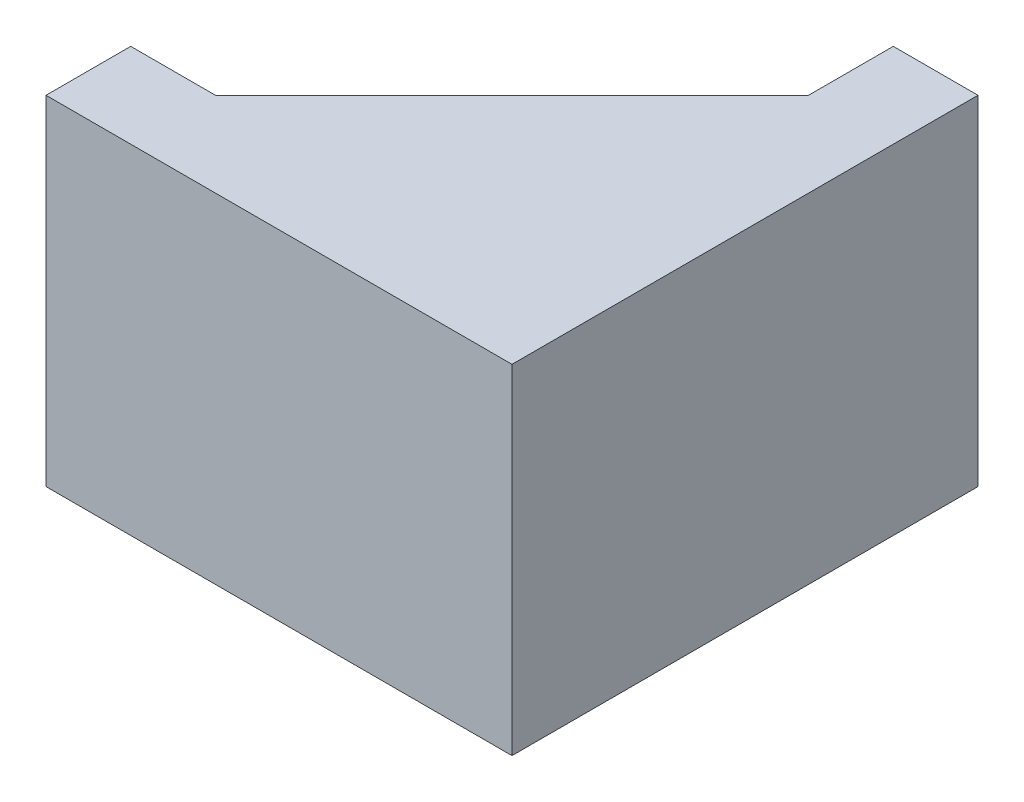
ISO-10303-21;
HEADER;
FILE_DESCRIPTION(('STEP AP214'),'2;1');
FILE_NAME('part.step','',(''),(''),'','','');
FILE_SCHEMA(('AUTOMOTIVE_DESIGN { 1 0 10303 214 1 1 1 1 }'));
ENDSEC;
DATA;
#1=APPLICATION_CONTEXT('core data for automotive mechanical design processes');
#2=APPLICATION_PROTOCOL_DEFINITION('international standard','automotive_design',2000,#1);
#3=PRODUCT_CONTEXT('',#1,'mechanical');
#4=PRODUCT('Part','Part','',(#3));
#5=PRODUCT_RELATED_PRODUCT_CATEGORY('part','',(#4));
#6=PRODUCT_DEFINITION_FORMATION('','',#4);
#7=PRODUCT_DEFINITION_CONTEXT('part definition',#1,'design');
#8=PRODUCT_DEFINITION('design','',#6,#7);
#9=PRODUCT_DEFINITION_SHAPE('','',#8);
#10=(LENGTH_UNIT() NAMED_UNIT(*) SI_UNIT(.MILLI.,.METRE.));
#11=(NAMED_UNIT(*) PLANE_ANGLE_UNIT() SI_UNIT($,.RADIAN.));
#12=(NAMED_UNIT(*) SI_UNIT($,.STERADIAN.) SOLID_ANGLE_UNIT());
#13=UNCERTAINTY_MEASURE_WITH_UNIT(LENGTH_MEASURE(1.E-05),#10,'distance_accuracy_value','');
#14=(GEOMETRIC_REPRESENTATION_CONTEXT(3) GLOBAL_UNCERTAINTY_ASSIGNED_CONTEXT((#13)) GLOBAL_UNIT_ASSIGNED_CONTEXT((#10,
#11,#12)) REPRESENTATION_CONTEXT('',''));
#15=CARTESIAN_POINT('',(0.,0.,0.));
#16=DIRECTION('',(0.,0.,1.));
#17=DIRECTION('',(1.,0.,0.));
#18=AXIS2_PLACEMENT_3D('',#15,#16,#17);
#19=CARTESIAN_POINT('',(0.,20.,0.));
#20=DIRECTION('',(-1.,0.,0.));
#21=DIRECTION('',(0.,0.,1.));
#22=AXIS2_PLACEMENT_3D('',#19,#20,#21);
#23=PLANE('',#22);
#24=DIRECTION('',(0.,0.,-1.));
#25=VECTOR('',#24,1.);
#26=CARTESIAN_POINT('',(0.,0.,0.));
#27=LINE('',#26,#25);
#28=CARTESIAN_POINT('',(0.,0.,0.));
#29=VERTEX_POINT('',#28);
#30=CARTESIAN_POINT('',(0.,0.,-27.5));
#31=VERTEX_POINT('',#30);
#32=EDGE_CURVE('E140',#29,#31,#27,.T.);
#33=ORIENTED_EDGE('',*,*,#32,.T.);
#34=DIRECTION('',(0.,-1.,0.));
#35=VECTOR('',#34,1.);
#36=CARTESIAN_POINT('',(0.,20.,-27.5));
#37=LINE('',#36,#35);
#38=CARTESIAN_POINT('',(0.,20.,-27.5));
#39=VERTEX_POINT('',#38);
#40=EDGE_CURVE('E11',#39,#31,#37,.T.);
#41=ORIENTED_EDGE('',*,*,#40,.F.);
#42=DIRECTION('',(0.,0.,-1.));
#43=VECTOR('',#42,1.);
#44=CARTESIAN_POINT('',(0.,20.,0.));
#45=LINE('',#44,#43);
#46=CARTESIAN_POINT('',(0.,20.,0.));
#47=VERTEX_POINT('',#46);
#48=EDGE_CURVE('E159',#47,#39,#45,.T.);
#49=ORIENTED_EDGE('',*,*,#48,.F.);
#50=DIRECTION('',(0.,-1.,0.));
#51=VECTOR('',#50,1.);
#52=CARTESIAN_POINT('',(0.,20.,0.));
#53=LINE('',#52,#51);
#54=EDGE_CURVE('E136',#47,#29,#53,.T.);
#55=ORIENTED_EDGE('',*,*,#54,.T.);
#56=EDGE_LOOP('',(#33,#41,#49,#55));
#57=FACE_BOUND('',#56,.T.);
#58=ADVANCED_FACE('F45',(#57),#23,.F.);
#59=CARTESIAN_POINT('',(0.,20.,-27.5));
#60=DIRECTION('',(0.,0.,1.));
#61=DIRECTION('',(1.,0.,0.));
#62=AXIS2_PLACEMENT_3D('',#59,#60,#61);
#63=PLANE('',#62);
#64=DIRECTION('',(-1.,0.,0.));
#65=VECTOR('',#64,1.);
#66=CARTESIAN_POINT('',(0.,0.,-27.5));
#67=LINE('',#66,#65);
#68=CARTESIAN_POINT('',(-5.,0.,-27.5));
#69=VERTEX_POINT('',#68);
#70=EDGE_CURVE('E144',#31,#69,#67,.T.);
#71=ORIENTED_EDGE('',*,*,#70,.T.);
#72=DIRECTION('',(0.,-1.,0.));
#73=VECTOR('',#72,1.);
#74=CARTESIAN_POINT('',(-5.,20.,-27.5));
#75=LINE('',#74,#73);
#76=CARTESIAN_POINT('',(-5.,20.,-27.5));
#77=VERTEX_POINT('',#76);
#78=EDGE_CURVE('E54',#77,#69,#75,.T.);
#79=ORIENTED_EDGE('',*,*,#78,.F.);
#80=DIRECTION('',(-1.,0.,0.));
#81=VECTOR('',#80,1.);
#82=CARTESIAN_POINT('',(0.,20.,-27.5));
#83=LINE('',#82,#81);
#84=EDGE_CURVE('E102',#39,#77,#83,.T.);
#85=ORIENTED_EDGE('',*,*,#84,.F.);
#86=ORIENTED_EDGE('',*,*,#40,.T.);
#87=EDGE_LOOP('',(#71,#79,#85,#86));
#88=FACE_BOUND('',#87,.T.);
#89=ADVANCED_FACE('F193',(#88),#63,.F.);
#90=CARTESIAN_POINT('',(-5.,20.,-27.5));
#91=DIRECTION('',(1.,0.,0.));
#92=DIRECTION('',(0.,0.,-1.));
#93=AXIS2_PLACEMENT_3D('',#90,#91,#92);
#94=PLANE('',#93);
#95=DIRECTION('',(0.,0.,1.));
#96=VECTOR('',#95,1.);
#97=CARTESIAN_POINT('',(-5.,0.,-27.5));
#98=LINE('',#97,#96);
#99=CARTESIAN_POINT('',(-5.,0.,-22.5));
#100=VERTEX_POINT('',#99);
#101=EDGE_CURVE('E147',#69,#100,#98,.T.);
#102=ORIENTED_EDGE('',*,*,#101,.T.);
#103=DIRECTION('',(0.,-1.,0.));
#104=VECTOR('',#103,1.);
#105=CARTESIAN_POINT('',(-5.,20.,-22.5));
#106=LINE('',#105,#104);
#107=CARTESIAN_POINT('',(-5.,20.,-22.5));
#108=VERTEX_POINT('',#107);
#109=EDGE_CURVE('E166',#108,#100,#106,.T.);
#110=ORIENTED_EDGE('',*,*,#109,.F.);
#111=DIRECTION('',(0.,0.,1.));
#112=VECTOR('',#111,1.);
#113=CARTESIAN_POINT('',(-5.,20.,-27.5));
#114=LINE('',#113,#112);
#115=EDGE_CURVE('E176',#77,#108,#114,.T.);
#116=ORIENTED_EDGE('',*,*,#115,.F.);
#117=ORIENTED_EDGE('',*,*,#78,.T.);
#118=EDGE_LOOP('',(#102,#110,#116,#117));
#119=FACE_BOUND('',#118,.T.);
#120=ADVANCED_FACE('F174',(#119),#94,.F.);
#121=CARTESIAN_POINT('',(-22.5,20.,-5.));
#122=DIRECTION('',(0.707106781186548,0.,0.707106781186548));
#123=DIRECTION('',(0.707106781186548,0.,-0.707106781186548));
#124=AXIS2_PLACEMENT_3D('',#121,#122,#123);
#125=PLANE('',#124);
#126=DIRECTION('',(-0.707106781186548,0.,0.707106781186548));
#127=VECTOR('',#126,1.);
#128=CARTESIAN_POINT('',(-22.5,0.,-5.));
#129=LINE('',#128,#127);
#130=CARTESIAN_POINT('',(-22.5,0.,-5.));
#131=VERTEX_POINT('',#130);
#132=EDGE_CURVE('E150',#100,#131,#129,.T.);
#133=ORIENTED_EDGE('',*,*,#132,.T.);
#134=DIRECTION('',(0.,-1.,0.));
#135=VECTOR('',#134,1.);
#136=CARTESIAN_POINT('',(-22.5,20.,-5.));
#137=LINE('',#136,#135);
#138=CARTESIAN_POINT('',(-22.5,20.,-5.));
#139=VERTEX_POINT('',#138);
#140=EDGE_CURVE('E129',#139,#131,#137,.T.);
#141=ORIENTED_EDGE('',*,*,#140,.F.);
#142=DIRECTION('',(-0.707106781186548,0.,0.707106781186548));
#143=VECTOR('',#142,1.);
#144=CARTESIAN_POINT('',(-22.5,20.,-5.));
#145=LINE('',#144,#143);
#146=EDGE_CURVE('E118',#108,#139,#145,.T.);
#147=ORIENTED_EDGE('',*,*,#146,.F.);
#148=ORIENTED_EDGE('',*,*,#109,.T.);
#149=EDGE_LOOP('',(#133,#141,#147,#148));
#150=FACE_BOUND('',#149,.T.);
#151=ADVANCED_FACE('F182',(#150),#125,.F.);
#152=CARTESIAN_POINT('',(-27.5,20.,-5.));
#153=DIRECTION('',(0.,0.,1.));
#154=DIRECTION('',(1.,0.,0.));
#155=AXIS2_PLACEMENT_3D('',#152,#153,#154);
#156=PLANE('',#155);
#157=DIRECTION('',(-1.,0.,0.));
#158=VECTOR('',#157,1.);
#159=CARTESIAN_POINT('',(-27.5,0.,-5.));
#160=LINE('',#159,#158);
#161=CARTESIAN_POINT('',(-27.5,0.,-5.));
#162=VERTEX_POINT('',#161);
#163=EDGE_CURVE('E127',#131,#162,#160,.T.);
#164=ORIENTED_EDGE('',*,*,#163,.T.);
#165=DIRECTION('',(0.,-1.,0.));
#166=VECTOR('',#165,1.);
#167=CARTESIAN_POINT('',(-27.5,20.,-5.));
#168=LINE('',#167,#166);
#169=CARTESIAN_POINT('',(-27.5,20.,-5.));
#170=VERTEX_POINT('',#169);
#171=EDGE_CURVE('E124',#170,#162,#168,.T.);
#172=ORIENTED_EDGE('',*,*,#171,.F.);
#173=DIRECTION('',(-1.,0.,0.));
#174=VECTOR('',#173,1.);
#175=CARTESIAN_POINT('',(-27.5,20.,-5.));
#176=LINE('',#175,#174);
#177=EDGE_CURVE('E112',#139,#170,#176,.T.);
#178=ORIENTED_EDGE('',*,*,#177,.F.);
#179=ORIENTED_EDGE('',*,*,#140,.T.);
#180=EDGE_LOOP('',(#164,#172,#178,#179));
#181=FACE_BOUND('',#180,.T.);
#182=ADVANCED_FACE('F125',(#181),#156,.F.);
#183=CARTESIAN_POINT('',(-27.5,20.,0.));
#184=DIRECTION('',(1.,0.,0.));
#185=DIRECTION('',(0.,0.,-1.));
#186=AXIS2_PLACEMENT_3D('',#183,#184,#185);
#187=PLANE('',#186);
#188=DIRECTION('',(0.,0.,1.));
#189=VECTOR('',#188,1.);
#190=CARTESIAN_POINT('',(-27.5,0.,0.));
#191=LINE('',#190,#189);
#192=CARTESIAN_POINT('',(-27.5,0.,0.));
#193=VERTEX_POINT('',#192);
#194=EDGE_CURVE('E88',#162,#193,#191,.T.);
#195=ORIENTED_EDGE('',*,*,#194,.T.);
#196=DIRECTION('',(0.,-1.,0.));
#197=VECTOR('',#196,1.);
#198=CARTESIAN_POINT('',(-27.5,20.,0.));
#199=LINE('',#198,#197);
#200=CARTESIAN_POINT('',(-27.5,20.,0.));
#201=VERTEX_POINT('',#200);
#202=EDGE_CURVE('E130',#201,#193,#199,.T.);
#203=ORIENTED_EDGE('',*,*,#202,.F.);
#204=DIRECTION('',(0.,0.,1.));
#205=VECTOR('',#204,1.);
#206=CARTESIAN_POINT('',(-27.5,20.,0.));
#207=LINE('',#206,#205);
#208=EDGE_CURVE('E116',#170,#201,#207,.T.);
#209=ORIENTED_EDGE('',*,*,#208,.F.);
#210=ORIENTED_EDGE('',*,*,#171,.T.);
#211=EDGE_LOOP('',(#195,#203,#209,#210));
#212=FACE_BOUND('',#211,.T.);
#213=ADVANCED_FACE('F132',(#212),#187,.F.);
#214=CARTESIAN_POINT('',(0.,20.,0.));
#215=DIRECTION('',(0.,0.,-1.));
#216=DIRECTION('',(-1.,0.,0.));
#217=AXIS2_PLACEMENT_3D('',#214,#215,#216);
#218=PLANE('',#217);
#219=DIRECTION('',(1.,0.,0.));
#220=VECTOR('',#219,1.);
#221=CARTESIAN_POINT('',(0.,0.,0.));
#222=LINE('',#221,#220);
#223=EDGE_CURVE('E94',#193,#29,#222,.T.);
#224=ORIENTED_EDGE('',*,*,#223,.T.);
#225=ORIENTED_EDGE('',*,*,#54,.F.);
#226=DIRECTION('',(1.,0.,0.));
#227=VECTOR('',#226,1.);
#228=CARTESIAN_POINT('',(0.,20.,0.));
#229=LINE('',#228,#227);
#230=EDGE_CURVE('E62',#201,#47,#229,.T.);
#231=ORIENTED_EDGE('',*,*,#230,.F.);
#232=ORIENTED_EDGE('',*,*,#202,.T.);
#233=EDGE_LOOP('',(#224,#225,#231,#232));
#234=FACE_BOUND('',#233,.T.);
#235=ADVANCED_FACE('F207',(#234),#218,.F.);
#236=CARTESIAN_POINT('',(0.,20.,0.));
#237=DIRECTION('',(0.,1.,0.));
#238=DIRECTION('',(0.,0.,1.));
#239=AXIS2_PLACEMENT_3D('',#236,#237,#238);
#240=PLANE('',#239);
#241=ORIENTED_EDGE('',*,*,#48,.T.);
#242=ORIENTED_EDGE('',*,*,#84,.T.);
#243=ORIENTED_EDGE('',*,*,#115,.T.);
#244=ORIENTED_EDGE('',*,*,#146,.T.);
#245=ORIENTED_EDGE('',*,*,#177,.T.);
#246=ORIENTED_EDGE('',*,*,#208,.T.);
#247=ORIENTED_EDGE('',*,*,#230,.T.);
#248=EDGE_LOOP('',(#241,#242,#243,#244,#245,#246,#247));
#249=FACE_BOUND('',#248,.T.);
#250=ADVANCED_FACE('F114',(#249),#240,.T.);
#251=CARTESIAN_POINT('',(0.,0.,0.));
#252=DIRECTION('',(0.,1.,0.));
#253=DIRECTION('',(0.,0.,1.));
#254=AXIS2_PLACEMENT_3D('',#251,#252,#253);
#255=PLANE('',#254);
#256=ORIENTED_EDGE('',*,*,#32,.F.);
#257=ORIENTED_EDGE('',*,*,#223,.F.);
#258=ORIENTED_EDGE('',*,*,#194,.F.);
#259=ORIENTED_EDGE('',*,*,#163,.F.);
#260=ORIENTED_EDGE('',*,*,#132,.F.);
#261=ORIENTED_EDGE('',*,*,#101,.F.);
#262=ORIENTED_EDGE('',*,*,#70,.F.);
#263=EDGE_LOOP('',(#256,#257,#258,#259,#260,#261,#262));
#264=FACE_BOUND('',#263,.T.);
#265=ADVANCED_FACE('F180',(#264),#255,.F.);
#266=CLOSED_SHELL('',(#58,#89,#120,#151,#182,#213,#235,#250,#265));
#267=MANIFOLD_SOLID_BREP('B2',#266);
#268=ADVANCED_BREP_SHAPE_REPRESENTATION('',(#18,#267),#14);
#269=SHAPE_DEFINITION_REPRESENTATION(#9,#268);
ENDSEC;
END-ISO-10303-21;
